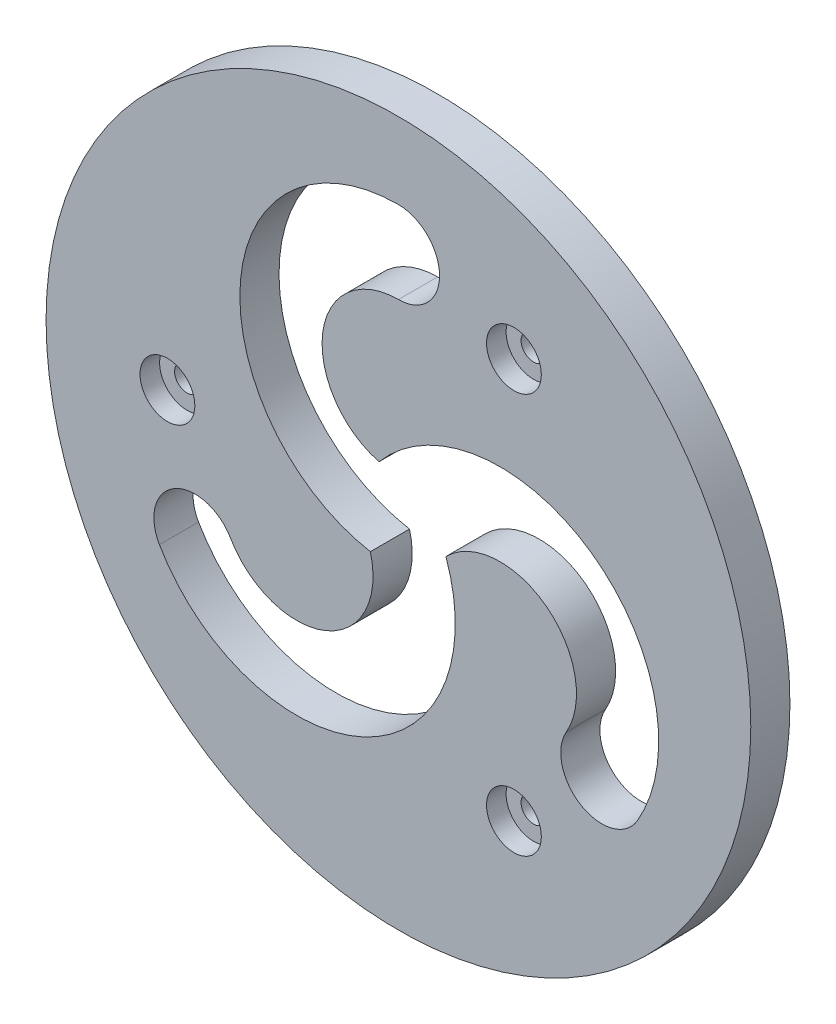
ISO-10303-21;
HEADER;
FILE_DESCRIPTION(('STEP AP214'),'2;1');
FILE_NAME('part.step','',(''),(''),'','','');
FILE_SCHEMA(('AUTOMOTIVE_DESIGN { 1 0 10303 214 1 1 1 1 }'));
ENDSEC;
DATA;
#1=APPLICATION_CONTEXT('core data for automotive mechanical design processes');
#2=APPLICATION_PROTOCOL_DEFINITION('international standard','automotive_design',2000,#1);
#3=PRODUCT_CONTEXT('',#1,'mechanical');
#4=PRODUCT('Part','Part','',(#3));
#5=PRODUCT_RELATED_PRODUCT_CATEGORY('part','',(#4));
#6=PRODUCT_DEFINITION_FORMATION('','',#4);
#7=PRODUCT_DEFINITION_CONTEXT('part definition',#1,'design');
#8=PRODUCT_DEFINITION('design','',#6,#7);
#9=PRODUCT_DEFINITION_SHAPE('','',#8);
#10=(LENGTH_UNIT() NAMED_UNIT(*) SI_UNIT(.MILLI.,.METRE.));
#11=(NAMED_UNIT(*) PLANE_ANGLE_UNIT() SI_UNIT($,.RADIAN.));
#12=(NAMED_UNIT(*) SI_UNIT($,.STERADIAN.) SOLID_ANGLE_UNIT());
#13=UNCERTAINTY_MEASURE_WITH_UNIT(LENGTH_MEASURE(1.E-05),#10,'distance_accuracy_value','');
#14=(GEOMETRIC_REPRESENTATION_CONTEXT(3) GLOBAL_UNCERTAINTY_ASSIGNED_CONTEXT((#13)) GLOBAL_UNIT_ASSIGNED_CONTEXT((#10,
#11,#12)) REPRESENTATION_CONTEXT('',''));
#15=CARTESIAN_POINT('',(0.,0.,0.));
#16=DIRECTION('',(0.,0.,1.));
#17=DIRECTION('',(1.,0.,0.));
#18=AXIS2_PLACEMENT_3D('',#15,#16,#17);
#19=CARTESIAN_POINT('',(14.75,-25.5477494116409,-5.));
#20=DIRECTION('',(0.,0.,1.));
#21=DIRECTION('',(1.,0.,0.));
#22=AXIS2_PLACEMENT_3D('',#19,#20,#21);
#23=CYLINDRICAL_SURFACE('',#22,1.5875);
#24=CARTESIAN_POINT('',(14.75,-25.5477494116409,0.));
#25=DIRECTION('',(0.,0.,1.));
#26=DIRECTION('',(1.,0.,0.));
#27=AXIS2_PLACEMENT_3D('',#24,#25,#26);
#28=CIRCLE('',#27,1.5875);
#29=CARTESIAN_POINT('',(16.3375,-25.5477494116409,0.));
#30=VERTEX_POINT('',#29);
#31=EDGE_CURVE('E221',#30,#30,#28,.T.);
#32=ORIENTED_EDGE('',*,*,#31,.F.);
#33=EDGE_LOOP('',(#32));
#34=FACE_BOUND('',#33,.T.);
#35=CARTESIAN_POINT('',(14.75,-25.5477494116409,2.5));
#36=DIRECTION('',(0.,0.,1.));
#37=DIRECTION('',(1.,0.,0.));
#38=AXIS2_PLACEMENT_3D('',#35,#36,#37);
#39=CIRCLE('',#38,1.5875);
#40=CARTESIAN_POINT('',(16.3375,-25.5477494116409,2.5));
#41=VERTEX_POINT('',#40);
#42=EDGE_CURVE('E71',#41,#41,#39,.F.);
#43=ORIENTED_EDGE('',*,*,#42,.F.);
#44=EDGE_LOOP('',(#43));
#45=FACE_BOUND('',#44,.T.);
#46=ADVANCED_FACE('F67',(#34,#45),#23,.F.);
#47=CARTESIAN_POINT('',(14.75,25.547749411641,-5.));
#48=DIRECTION('',(0.,0.,1.));
#49=DIRECTION('',(1.,0.,0.));
#50=AXIS2_PLACEMENT_3D('',#47,#48,#49);
#51=CYLINDRICAL_SURFACE('',#50,1.58750000000001);
#52=CARTESIAN_POINT('',(14.75,25.547749411641,0.));
#53=DIRECTION('',(0.,0.,1.));
#54=DIRECTION('',(1.,0.,0.));
#55=AXIS2_PLACEMENT_3D('',#52,#53,#54);
#56=CIRCLE('',#55,1.58750000000001);
#57=CARTESIAN_POINT('',(16.3375,25.547749411641,0.));
#58=VERTEX_POINT('',#57);
#59=EDGE_CURVE('E224',#58,#58,#56,.T.);
#60=ORIENTED_EDGE('',*,*,#59,.F.);
#61=EDGE_LOOP('',(#60));
#62=FACE_BOUND('',#61,.T.);
#63=CARTESIAN_POINT('',(14.75,25.547749411641,2.5));
#64=DIRECTION('',(0.,0.,1.));
#65=DIRECTION('',(1.,0.,0.));
#66=AXIS2_PLACEMENT_3D('',#63,#64,#65);
#67=CIRCLE('',#66,1.58750000000001);
#68=CARTESIAN_POINT('',(16.3375,25.547749411641,2.5));
#69=VERTEX_POINT('',#68);
#70=EDGE_CURVE('E231',#69,#69,#67,.F.);
#71=ORIENTED_EDGE('',*,*,#70,.F.);
#72=EDGE_LOOP('',(#71));
#73=FACE_BOUND('',#72,.T.);
#74=ADVANCED_FACE('F242',(#62,#73),#51,.F.);
#75=CARTESIAN_POINT('',(-29.5,0.,-5.));
#76=DIRECTION('',(0.,0.,1.));
#77=DIRECTION('',(1.,0.,0.));
#78=AXIS2_PLACEMENT_3D('',#75,#76,#77);
#79=CYLINDRICAL_SURFACE('',#78,1.5875);
#80=CARTESIAN_POINT('',(-29.5,0.,0.));
#81=DIRECTION('',(0.,0.,1.));
#82=DIRECTION('',(1.,0.,0.));
#83=AXIS2_PLACEMENT_3D('',#80,#81,#82);
#84=CIRCLE('',#83,1.5875);
#85=CARTESIAN_POINT('',(-27.9125,0.,0.));
#86=VERTEX_POINT('',#85);
#87=EDGE_CURVE('E185',#86,#86,#84,.T.);
#88=ORIENTED_EDGE('',*,*,#87,.F.);
#89=EDGE_LOOP('',(#88));
#90=FACE_BOUND('',#89,.T.);
#91=CARTESIAN_POINT('',(-29.5,0.,2.5));
#92=DIRECTION('',(0.,0.,1.));
#93=DIRECTION('',(1.,0.,0.));
#94=AXIS2_PLACEMENT_3D('',#91,#92,#93);
#95=CIRCLE('',#94,1.5875);
#96=CARTESIAN_POINT('',(-27.9125,0.,2.5));
#97=VERTEX_POINT('',#96);
#98=EDGE_CURVE('E229',#97,#97,#95,.F.);
#99=ORIENTED_EDGE('',*,*,#98,.F.);
#100=EDGE_LOOP('',(#99));
#101=FACE_BOUND('',#100,.T.);
#102=ADVANCED_FACE('F248',(#90,#101),#79,.F.);
#103=CARTESIAN_POINT('',(0.,0.,5.));
#104=DIRECTION('',(0.,0.,-1.));
#105=DIRECTION('',(-1.,0.,0.));
#106=AXIS2_PLACEMENT_3D('',#103,#104,#105);
#107=CYLINDRICAL_SURFACE('',#106,45.);
#108=CARTESIAN_POINT('',(0.,0.,5.));
#109=DIRECTION('',(0.,0.,1.));
#110=DIRECTION('',(1.,0.,0.));
#111=AXIS2_PLACEMENT_3D('',#108,#109,#110);
#112=CIRCLE('',#111,45.);
#113=CARTESIAN_POINT('',(45.,0.,5.));
#114=VERTEX_POINT('',#113);
#115=EDGE_CURVE('E12',#114,#114,#112,.T.);
#116=ORIENTED_EDGE('',*,*,#115,.F.);
#117=EDGE_LOOP('',(#116));
#118=FACE_BOUND('',#117,.T.);
#119=CARTESIAN_POINT('',(0.,0.,0.));
#120=DIRECTION('',(0.,0.,1.));
#121=DIRECTION('',(1.,0.,0.));
#122=AXIS2_PLACEMENT_3D('',#119,#120,#121);
#123=CIRCLE('',#122,45.);
#124=CARTESIAN_POINT('',(45.,0.,0.));
#125=VERTEX_POINT('',#124);
#126=EDGE_CURVE('E76',#125,#125,#123,.T.);
#127=ORIENTED_EDGE('',*,*,#126,.T.);
#128=EDGE_LOOP('',(#127));
#129=FACE_BOUND('',#128,.T.);
#130=ADVANCED_FACE('F69',(#118,#129),#107,.T.);
#131=CARTESIAN_POINT('',(0.,0.,5.));
#132=DIRECTION('',(0.,0.,1.));
#133=DIRECTION('',(1.,0.,0.));
#134=AXIS2_PLACEMENT_3D('',#131,#132,#133);
#135=PLANE('',#134);
#136=CARTESIAN_POINT('',(-29.5,0.,5.));
#137=DIRECTION('',(0.,0.,1.));
#138=DIRECTION('',(1.,0.,0.));
#139=AXIS2_PLACEMENT_3D('',#136,#137,#138);
#140=CIRCLE('',#139,3.5);
#141=CARTESIAN_POINT('',(-26.,0.,5.));
#142=VERTEX_POINT('',#141);
#143=EDGE_CURVE('E344',#142,#142,#140,.T.);
#144=ORIENTED_EDGE('',*,*,#143,.F.);
#145=EDGE_LOOP('',(#144));
#146=FACE_BOUND('',#145,.T.);
#147=CARTESIAN_POINT('',(14.75,-25.5477494116409,5.));
#148=DIRECTION('',(0.,0.,1.));
#149=DIRECTION('',(1.,0.,0.));
#150=AXIS2_PLACEMENT_3D('',#147,#148,#149);
#151=CIRCLE('',#150,3.5);
#152=CARTESIAN_POINT('',(18.25,-25.5477494116409,5.));
#153=VERTEX_POINT('',#152);
#154=EDGE_CURVE('E337',#153,#153,#151,.T.);
#155=ORIENTED_EDGE('',*,*,#154,.F.);
#156=EDGE_LOOP('',(#155));
#157=FACE_BOUND('',#156,.T.);
#158=CARTESIAN_POINT('',(14.75,25.547749411641,5.));
#159=DIRECTION('',(0.,0.,1.));
#160=DIRECTION('',(1.,0.,0.));
#161=AXIS2_PLACEMENT_3D('',#158,#159,#160);
#162=CIRCLE('',#161,3.5);
#163=CARTESIAN_POINT('',(18.25,25.547749411641,5.));
#164=VERTEX_POINT('',#163);
#165=EDGE_CURVE('E165',#164,#164,#162,.T.);
#166=ORIENTED_EDGE('',*,*,#165,.F.);
#167=EDGE_LOOP('',(#166));
#168=FACE_BOUND('',#167,.T.);
#169=CARTESIAN_POINT('',(0.,15.,5.));
#170=DIRECTION('',(0.,0.,1.));
#171=DIRECTION('',(1.,0.,0.));
#172=AXIS2_PLACEMENT_3D('',#169,#170,#171);
#173=CIRCLE('',#172,20.25);
#174=CARTESIAN_POINT('',(0.,35.25,5.));
#175=VERTEX_POINT('',#174);
#176=CARTESIAN_POINT('',(-3.58516212247075,-4.93010568350306,5.));
#177=VERTEX_POINT('',#176);
#178=EDGE_CURVE('E84',#175,#177,#173,.T.);
#179=ORIENTED_EDGE('',*,*,#178,.F.);
#180=CARTESIAN_POINT('',(0.,30.,5.));
#181=DIRECTION('',(0.,0.,1.));
#182=DIRECTION('',(1.,0.,0.));
#183=AXIS2_PLACEMENT_3D('',#180,#181,#182);
#184=CIRCLE('',#183,5.25);
#185=CARTESIAN_POINT('',(0.,24.75,5.));
#186=VERTEX_POINT('',#185);
#187=EDGE_CURVE('E159',#186,#175,#184,.T.);
#188=ORIENTED_EDGE('',*,*,#187,.F.);
#189=CARTESIAN_POINT('',(0.,15.,5.));
#190=DIRECTION('',(0.,0.,1.));
#191=DIRECTION('',(1.,0.,0.));
#192=AXIS2_PLACEMENT_3D('',#189,#190,#191);
#193=CIRCLE('',#192,9.75);
#194=CARTESIAN_POINT('',(-2.47701570402032,5.56989431649694,5.));
#195=VERTEX_POINT('',#194);
#196=EDGE_CURVE('E162',#186,#195,#193,.T.);
#197=ORIENTED_EDGE('',*,*,#196,.T.);
#198=CARTESIAN_POINT('',(12.9903810567666,-7.49999999999999,5.));
#199=DIRECTION('',(0.,0.,1.));
#200=DIRECTION('',(1.,0.,0.));
#201=AXIS2_PLACEMENT_3D('',#198,#199,#200);
#202=CIRCLE('',#201,20.25);
#203=CARTESIAN_POINT('',(30.5273954834037,-17.6249999999983,5.));
#204=VERTEX_POINT('',#203);
#205=EDGE_CURVE('E199',#204,#195,#202,.T.);
#206=ORIENTED_EDGE('',*,*,#205,.F.);
#207=CARTESIAN_POINT('',(25.9807621135351,-14.9999999999989,5.));
#208=DIRECTION('',(0.,0.,1.));
#209=DIRECTION('',(1.,0.,0.));
#210=AXIS2_PLACEMENT_3D('',#207,#208,#209);
#211=CIRCLE('',#210,5.25);
#212=CARTESIAN_POINT('',(21.4341287436663,-12.3749999999994,5.));
#213=VERTEX_POINT('',#212);
#214=EDGE_CURVE('E196',#213,#204,#211,.T.);
#215=ORIENTED_EDGE('',*,*,#214,.F.);
#216=CARTESIAN_POINT('',(12.9903810567666,-7.49999999999999,5.));
#217=DIRECTION('',(0.,0.,1.));
#218=DIRECTION('',(1.,0.,0.));
#219=AXIS2_PLACEMENT_3D('',#216,#217,#218);
#220=CIRCLE('',#219,9.75);
#221=CARTESIAN_POINT('',(6.06217782649108,-0.639788632993871,5.));
#222=VERTEX_POINT('',#221);
#223=EDGE_CURVE('E193',#213,#222,#220,.T.);
#224=ORIENTED_EDGE('',*,*,#223,.T.);
#225=CARTESIAN_POINT('',(-12.9903810567666,-7.50000000000001,5.));
#226=DIRECTION('',(0.,0.,1.));
#227=DIRECTION('',(1.,0.,0.));
#228=AXIS2_PLACEMENT_3D('',#225,#226,#227);
#229=CIRCLE('',#228,20.25);
#230=CARTESIAN_POINT('',(-30.5273954833992,-17.6250000000017,5.));
#231=VERTEX_POINT('',#230);
#232=EDGE_CURVE('E190',#231,#222,#229,.T.);
#233=ORIENTED_EDGE('',*,*,#232,.F.);
#234=CARTESIAN_POINT('',(-25.9807621135312,-15.0000000000011,5.));
#235=DIRECTION('',(0.,0.,1.));
#236=DIRECTION('',(1.,0.,0.));
#237=AXIS2_PLACEMENT_3D('',#234,#235,#236);
#238=CIRCLE('',#237,5.25);
#239=CARTESIAN_POINT('',(-21.4341287436634,-12.3750000000006,5.));
#240=VERTEX_POINT('',#239);
#241=EDGE_CURVE('E187',#240,#231,#238,.T.);
#242=ORIENTED_EDGE('',*,*,#241,.F.);
#243=CARTESIAN_POINT('',(-12.9903810567666,-7.50000000000001,5.));
#244=DIRECTION('',(0.,0.,1.));
#245=DIRECTION('',(1.,0.,0.));
#246=AXIS2_PLACEMENT_3D('',#243,#244,#245);
#247=CIRCLE('',#246,9.75);
#248=EDGE_CURVE('E184',#240,#177,#247,.T.);
#249=ORIENTED_EDGE('',*,*,#248,.T.);
#250=EDGE_LOOP('',(#179,#188,#197,#206,#215,#224,#233,#242,#249));
#251=FACE_BOUND('',#250,.T.);
#252=ORIENTED_EDGE('',*,*,#115,.T.);
#253=EDGE_LOOP('',(#252));
#254=FACE_BOUND('',#253,.T.);
#255=ADVANCED_FACE('F286',(#146,#157,#168,#251,#254),#135,.T.);
#256=CARTESIAN_POINT('',(0.,0.,0.));
#257=DIRECTION('',(0.,0.,1.));
#258=DIRECTION('',(1.,0.,0.));
#259=AXIS2_PLACEMENT_3D('',#256,#257,#258);
#260=PLANE('',#259);
#261=ORIENTED_EDGE('',*,*,#87,.T.);
#262=EDGE_LOOP('',(#261));
#263=FACE_BOUND('',#262,.T.);
#264=ORIENTED_EDGE('',*,*,#59,.T.);
#265=EDGE_LOOP('',(#264));
#266=FACE_BOUND('',#265,.T.);
#267=ORIENTED_EDGE('',*,*,#31,.T.);
#268=EDGE_LOOP('',(#267));
#269=FACE_BOUND('',#268,.T.);
#270=CARTESIAN_POINT('',(0.,30.,0.));
#271=DIRECTION('',(0.,0.,1.));
#272=DIRECTION('',(1.,0.,0.));
#273=AXIS2_PLACEMENT_3D('',#270,#271,#272);
#274=CIRCLE('',#273,5.25);
#275=CARTESIAN_POINT('',(0.,24.75,0.));
#276=VERTEX_POINT('',#275);
#277=CARTESIAN_POINT('',(0.,35.25,0.));
#278=VERTEX_POINT('',#277);
#279=EDGE_CURVE('E153',#276,#278,#274,.T.);
#280=ORIENTED_EDGE('',*,*,#279,.T.);
#281=CARTESIAN_POINT('',(0.,15.,0.));
#282=DIRECTION('',(0.,0.,1.));
#283=DIRECTION('',(1.,0.,0.));
#284=AXIS2_PLACEMENT_3D('',#281,#282,#283);
#285=CIRCLE('',#284,20.25);
#286=CARTESIAN_POINT('',(-3.58516212247075,-4.93010568350306,0.));
#287=VERTEX_POINT('',#286);
#288=EDGE_CURVE('E148',#278,#287,#285,.T.);
#289=ORIENTED_EDGE('',*,*,#288,.T.);
#290=CARTESIAN_POINT('',(-12.9903810567666,-7.50000000000001,0.));
#291=DIRECTION('',(0.,0.,1.));
#292=DIRECTION('',(1.,0.,0.));
#293=AXIS2_PLACEMENT_3D('',#290,#291,#292);
#294=CIRCLE('',#293,9.75);
#295=CARTESIAN_POINT('',(-21.4341287436642,-12.3750000000011,0.));
#296=VERTEX_POINT('',#295);
#297=EDGE_CURVE('E140',#296,#287,#294,.T.);
#298=ORIENTED_EDGE('',*,*,#297,.F.);
#299=CARTESIAN_POINT('',(-25.9807621135312,-15.0000000000011,0.));
#300=DIRECTION('',(0.,0.,1.));
#301=DIRECTION('',(1.,0.,0.));
#302=AXIS2_PLACEMENT_3D('',#299,#300,#301);
#303=CIRCLE('',#302,5.25);
#304=CARTESIAN_POINT('',(-30.5273954833992,-17.6250000000017,0.));
#305=VERTEX_POINT('',#304);
#306=EDGE_CURVE('E92',#296,#305,#303,.T.);
#307=ORIENTED_EDGE('',*,*,#306,.T.);
#308=CARTESIAN_POINT('',(-12.9903810567666,-7.50000000000001,0.));
#309=DIRECTION('',(0.,0.,1.));
#310=DIRECTION('',(1.,0.,0.));
#311=AXIS2_PLACEMENT_3D('',#308,#309,#310);
#312=CIRCLE('',#311,20.25);
#313=CARTESIAN_POINT('',(6.06217782649108,-0.639788632993871,0.));
#314=VERTEX_POINT('',#313);
#315=EDGE_CURVE('E169',#305,#314,#312,.T.);
#316=ORIENTED_EDGE('',*,*,#315,.T.);
#317=CARTESIAN_POINT('',(12.9903810567666,-7.49999999999999,0.));
#318=DIRECTION('',(0.,0.,1.));
#319=DIRECTION('',(1.,0.,0.));
#320=AXIS2_PLACEMENT_3D('',#317,#318,#319);
#321=CIRCLE('',#320,9.75);
#322=CARTESIAN_POINT('',(21.4341287436663,-12.3749999999994,0.));
#323=VERTEX_POINT('',#322);
#324=EDGE_CURVE('E172',#323,#314,#321,.T.);
#325=ORIENTED_EDGE('',*,*,#324,.F.);
#326=CARTESIAN_POINT('',(25.9807621135351,-14.9999999999989,0.));
#327=DIRECTION('',(0.,0.,1.));
#328=DIRECTION('',(1.,0.,0.));
#329=AXIS2_PLACEMENT_3D('',#326,#327,#328);
#330=CIRCLE('',#329,5.25);
#331=CARTESIAN_POINT('',(30.5273954834037,-17.6249999999983,0.));
#332=VERTEX_POINT('',#331);
#333=EDGE_CURVE('E174',#323,#332,#330,.T.);
#334=ORIENTED_EDGE('',*,*,#333,.T.);
#335=CARTESIAN_POINT('',(12.9903810567666,-7.49999999999999,0.));
#336=DIRECTION('',(0.,0.,1.));
#337=DIRECTION('',(1.,0.,0.));
#338=AXIS2_PLACEMENT_3D('',#335,#336,#337);
#339=CIRCLE('',#338,20.25);
#340=CARTESIAN_POINT('',(-2.47701570402032,5.56989431649694,0.));
#341=VERTEX_POINT('',#340);
#342=EDGE_CURVE('E177',#332,#341,#339,.T.);
#343=ORIENTED_EDGE('',*,*,#342,.T.);
#344=CARTESIAN_POINT('',(0.,15.,0.));
#345=DIRECTION('',(0.,0.,1.));
#346=DIRECTION('',(1.,0.,0.));
#347=AXIS2_PLACEMENT_3D('',#344,#345,#346);
#348=CIRCLE('',#347,9.75);
#349=EDGE_CURVE('E180',#276,#341,#348,.T.);
#350=ORIENTED_EDGE('',*,*,#349,.F.);
#351=EDGE_LOOP('',(#280,#289,#298,#307,#316,#325,#334,#343,#350));
#352=FACE_BOUND('',#351,.T.);
#353=ORIENTED_EDGE('',*,*,#126,.F.);
#354=EDGE_LOOP('',(#353));
#355=FACE_BOUND('',#354,.T.);
#356=ADVANCED_FACE('F155',(#263,#266,#269,#352,#355),#260,.F.);
#357=CARTESIAN_POINT('',(0.,15.,0.));
#358=DIRECTION('',(0.,0.,1.));
#359=DIRECTION('',(1.,0.,0.));
#360=AXIS2_PLACEMENT_3D('',#357,#358,#359);
#361=CYLINDRICAL_SURFACE('',#360,20.25);
#362=ORIENTED_EDGE('',*,*,#178,.T.);
#363=DIRECTION('',(0.,0.,1.));
#364=VECTOR('',#363,1.);
#365=CARTESIAN_POINT('',(-3.58516212247075,-4.93010568350306,0.));
#366=LINE('',#365,#364);
#367=EDGE_CURVE('E143',#287,#177,#366,.T.);
#368=ORIENTED_EDGE('',*,*,#367,.F.);
#369=ORIENTED_EDGE('',*,*,#288,.F.);
#370=DIRECTION('',(0.,0.,1.));
#371=VECTOR('',#370,1.);
#372=CARTESIAN_POINT('',(0.,35.25,0.));
#373=LINE('',#372,#371);
#374=EDGE_CURVE('E204',#278,#175,#373,.T.);
#375=ORIENTED_EDGE('',*,*,#374,.T.);
#376=EDGE_LOOP('',(#362,#368,#369,#375));
#377=FACE_BOUND('',#376,.T.);
#378=ADVANCED_FACE('F151',(#377),#361,.F.);
#379=CARTESIAN_POINT('',(0.,30.,0.));
#380=DIRECTION('',(0.,0.,1.));
#381=DIRECTION('',(1.,0.,0.));
#382=AXIS2_PLACEMENT_3D('',#379,#380,#381);
#383=CYLINDRICAL_SURFACE('',#382,5.25);
#384=ORIENTED_EDGE('',*,*,#187,.T.);
#385=ORIENTED_EDGE('',*,*,#374,.F.);
#386=ORIENTED_EDGE('',*,*,#279,.F.);
#387=DIRECTION('',(0.,0.,1.));
#388=VECTOR('',#387,1.);
#389=CARTESIAN_POINT('',(0.,24.75,0.));
#390=LINE('',#389,#388);
#391=EDGE_CURVE('E206',#276,#186,#390,.T.);
#392=ORIENTED_EDGE('',*,*,#391,.T.);
#393=EDGE_LOOP('',(#384,#385,#386,#392));
#394=FACE_BOUND('',#393,.T.);
#395=ADVANCED_FACE('F254',(#394),#383,.F.);
#396=CARTESIAN_POINT('',(0.,15.,0.));
#397=DIRECTION('',(0.,0.,1.));
#398=DIRECTION('',(1.,0.,0.));
#399=AXIS2_PLACEMENT_3D('',#396,#397,#398);
#400=CYLINDRICAL_SURFACE('',#399,9.75);
#401=ORIENTED_EDGE('',*,*,#196,.F.);
#402=ORIENTED_EDGE('',*,*,#391,.F.);
#403=ORIENTED_EDGE('',*,*,#349,.T.);
#404=DIRECTION('',(0.,0.,1.));
#405=VECTOR('',#404,1.);
#406=CARTESIAN_POINT('',(-2.47701570402032,5.56989431649694,0.));
#407=LINE('',#406,#405);
#408=EDGE_CURVE('E208',#341,#195,#407,.T.);
#409=ORIENTED_EDGE('',*,*,#408,.T.);
#410=EDGE_LOOP('',(#401,#402,#403,#409));
#411=FACE_BOUND('',#410,.T.);
#412=ADVANCED_FACE('F257',(#411),#400,.T.);
#413=CARTESIAN_POINT('',(12.9903810567666,-7.49999999999999,0.));
#414=DIRECTION('',(0.,0.,1.));
#415=DIRECTION('',(1.,0.,0.));
#416=AXIS2_PLACEMENT_3D('',#413,#414,#415);
#417=CYLINDRICAL_SURFACE('',#416,20.25);
#418=ORIENTED_EDGE('',*,*,#205,.T.);
#419=ORIENTED_EDGE('',*,*,#408,.F.);
#420=ORIENTED_EDGE('',*,*,#342,.F.);
#421=DIRECTION('',(0.,0.,1.));
#422=VECTOR('',#421,1.);
#423=CARTESIAN_POINT('',(30.5273954834037,-17.6249999999983,0.));
#424=LINE('',#423,#422);
#425=EDGE_CURVE('E210',#332,#204,#424,.T.);
#426=ORIENTED_EDGE('',*,*,#425,.T.);
#427=EDGE_LOOP('',(#418,#419,#420,#426));
#428=FACE_BOUND('',#427,.T.);
#429=ADVANCED_FACE('F261',(#428),#417,.F.);
#430=CARTESIAN_POINT('',(25.9807621135351,-14.9999999999989,0.));
#431=DIRECTION('',(0.,0.,1.));
#432=DIRECTION('',(1.,0.,0.));
#433=AXIS2_PLACEMENT_3D('',#430,#431,#432);
#434=CYLINDRICAL_SURFACE('',#433,5.25);
#435=ORIENTED_EDGE('',*,*,#214,.T.);
#436=ORIENTED_EDGE('',*,*,#425,.F.);
#437=ORIENTED_EDGE('',*,*,#333,.F.);
#438=DIRECTION('',(0.,0.,1.));
#439=VECTOR('',#438,1.);
#440=CARTESIAN_POINT('',(21.4341287436663,-12.3749999999994,0.));
#441=LINE('',#440,#439);
#442=EDGE_CURVE('E212',#323,#213,#441,.T.);
#443=ORIENTED_EDGE('',*,*,#442,.T.);
#444=EDGE_LOOP('',(#435,#436,#437,#443));
#445=FACE_BOUND('',#444,.T.);
#446=ADVANCED_FACE('F265',(#445),#434,.F.);
#447=CARTESIAN_POINT('',(12.9903810567666,-7.49999999999999,0.));
#448=DIRECTION('',(0.,0.,1.));
#449=DIRECTION('',(1.,0.,0.));
#450=AXIS2_PLACEMENT_3D('',#447,#448,#449);
#451=CYLINDRICAL_SURFACE('',#450,9.75);
#452=ORIENTED_EDGE('',*,*,#223,.F.);
#453=ORIENTED_EDGE('',*,*,#442,.F.);
#454=ORIENTED_EDGE('',*,*,#324,.T.);
#455=DIRECTION('',(0.,0.,1.));
#456=VECTOR('',#455,1.);
#457=CARTESIAN_POINT('',(6.06217782649108,-0.639788632993871,0.));
#458=LINE('',#457,#456);
#459=EDGE_CURVE('E214',#314,#222,#458,.T.);
#460=ORIENTED_EDGE('',*,*,#459,.T.);
#461=EDGE_LOOP('',(#452,#453,#454,#460));
#462=FACE_BOUND('',#461,.T.);
#463=ADVANCED_FACE('F269',(#462),#451,.T.);
#464=CARTESIAN_POINT('',(-12.9903810567666,-7.50000000000001,0.));
#465=DIRECTION('',(0.,0.,1.));
#466=DIRECTION('',(1.,0.,0.));
#467=AXIS2_PLACEMENT_3D('',#464,#465,#466);
#468=CYLINDRICAL_SURFACE('',#467,20.25);
#469=ORIENTED_EDGE('',*,*,#232,.T.);
#470=ORIENTED_EDGE('',*,*,#459,.F.);
#471=ORIENTED_EDGE('',*,*,#315,.F.);
#472=DIRECTION('',(0.,0.,1.));
#473=VECTOR('',#472,1.);
#474=CARTESIAN_POINT('',(-30.5273954833992,-17.6250000000017,0.));
#475=LINE('',#474,#473);
#476=EDGE_CURVE('E216',#305,#231,#475,.T.);
#477=ORIENTED_EDGE('',*,*,#476,.T.);
#478=EDGE_LOOP('',(#469,#470,#471,#477));
#479=FACE_BOUND('',#478,.T.);
#480=ADVANCED_FACE('F273',(#479),#468,.F.);
#481=CARTESIAN_POINT('',(-25.9807621135312,-15.0000000000011,0.));
#482=DIRECTION('',(0.,0.,1.));
#483=DIRECTION('',(1.,0.,0.));
#484=AXIS2_PLACEMENT_3D('',#481,#482,#483);
#485=CYLINDRICAL_SURFACE('',#484,5.25);
#486=ORIENTED_EDGE('',*,*,#241,.T.);
#487=ORIENTED_EDGE('',*,*,#476,.F.);
#488=ORIENTED_EDGE('',*,*,#306,.F.);
#489=DIRECTION('',(0.,0.,1.));
#490=VECTOR('',#489,1.);
#491=CARTESIAN_POINT('',(-21.4341287436634,-12.3750000000006,0.));
#492=LINE('',#491,#490);
#493=EDGE_CURVE('E145',#296,#240,#492,.T.);
#494=ORIENTED_EDGE('',*,*,#493,.T.);
#495=EDGE_LOOP('',(#486,#487,#488,#494));
#496=FACE_BOUND('',#495,.T.);
#497=ADVANCED_FACE('F277',(#496),#485,.F.);
#498=CARTESIAN_POINT('',(-12.9903810567666,-7.50000000000001,0.));
#499=DIRECTION('',(0.,0.,1.));
#500=DIRECTION('',(1.,0.,0.));
#501=AXIS2_PLACEMENT_3D('',#498,#499,#500);
#502=CYLINDRICAL_SURFACE('',#501,9.75);
#503=ORIENTED_EDGE('',*,*,#248,.F.);
#504=ORIENTED_EDGE('',*,*,#493,.F.);
#505=ORIENTED_EDGE('',*,*,#297,.T.);
#506=ORIENTED_EDGE('',*,*,#367,.T.);
#507=EDGE_LOOP('',(#503,#504,#505,#506));
#508=FACE_BOUND('',#507,.T.);
#509=ADVANCED_FACE('F142',(#508),#502,.T.);
#510=CARTESIAN_POINT('',(-29.5,0.,2.5));
#511=DIRECTION('',(0.,0.,1.));
#512=DIRECTION('',(1.,0.,0.));
#513=AXIS2_PLACEMENT_3D('',#510,#511,#512);
#514=PLANE('',#513);
#515=CARTESIAN_POINT('',(-29.5,0.,2.5));
#516=DIRECTION('',(0.,0.,1.));
#517=DIRECTION('',(1.,0.,0.));
#518=AXIS2_PLACEMENT_3D('',#515,#516,#517);
#519=CIRCLE('',#518,3.5);
#520=CARTESIAN_POINT('',(-26.,0.,2.5));
#521=VERTEX_POINT('',#520);
#522=EDGE_CURVE('E232',#521,#521,#519,.T.);
#523=ORIENTED_EDGE('',*,*,#522,.T.);
#524=EDGE_LOOP('',(#523));
#525=FACE_BOUND('',#524,.T.);
#526=ORIENTED_EDGE('',*,*,#98,.T.);
#527=EDGE_LOOP('',(#526));
#528=FACE_BOUND('',#527,.T.);
#529=ADVANCED_FACE('F283',(#525,#528),#514,.T.);
#530=CARTESIAN_POINT('',(-29.5,0.,2.5));
#531=DIRECTION('',(0.,0.,1.));
#532=DIRECTION('',(1.,0.,0.));
#533=AXIS2_PLACEMENT_3D('',#530,#531,#532);
#534=CYLINDRICAL_SURFACE('',#533,3.5);
#535=ORIENTED_EDGE('',*,*,#522,.F.);
#536=EDGE_LOOP('',(#535));
#537=FACE_BOUND('',#536,.T.);
#538=ORIENTED_EDGE('',*,*,#143,.T.);
#539=EDGE_LOOP('',(#538));
#540=FACE_BOUND('',#539,.T.);
#541=ADVANCED_FACE('F304',(#537,#540),#534,.F.);
#542=CARTESIAN_POINT('',(14.75,25.547749411641,2.5));
#543=DIRECTION('',(0.,0.,1.));
#544=DIRECTION('',(1.,0.,0.));
#545=AXIS2_PLACEMENT_3D('',#542,#543,#544);
#546=PLANE('',#545);
#547=CARTESIAN_POINT('',(14.75,25.547749411641,2.5));
#548=DIRECTION('',(0.,0.,1.));
#549=DIRECTION('',(1.,0.,0.));
#550=AXIS2_PLACEMENT_3D('',#547,#548,#549);
#551=CIRCLE('',#550,3.5);
#552=CARTESIAN_POINT('',(18.25,25.547749411641,2.5));
#553=VERTEX_POINT('',#552);
#554=EDGE_CURVE('E333',#553,#553,#551,.T.);
#555=ORIENTED_EDGE('',*,*,#554,.T.);
#556=EDGE_LOOP('',(#555));
#557=FACE_BOUND('',#556,.T.);
#558=ORIENTED_EDGE('',*,*,#70,.T.);
#559=EDGE_LOOP('',(#558));
#560=FACE_BOUND('',#559,.T.);
#561=ADVANCED_FACE('F310',(#557,#560),#546,.T.);
#562=CARTESIAN_POINT('',(14.75,25.547749411641,2.5));
#563=DIRECTION('',(0.,0.,1.));
#564=DIRECTION('',(1.,0.,0.));
#565=AXIS2_PLACEMENT_3D('',#562,#563,#564);
#566=CYLINDRICAL_SURFACE('',#565,3.5);
#567=ORIENTED_EDGE('',*,*,#554,.F.);
#568=EDGE_LOOP('',(#567));
#569=FACE_BOUND('',#568,.T.);
#570=ORIENTED_EDGE('',*,*,#165,.T.);
#571=EDGE_LOOP('',(#570));
#572=FACE_BOUND('',#571,.T.);
#573=ADVANCED_FACE('F318',(#569,#572),#566,.F.);
#574=CARTESIAN_POINT('',(14.75,-25.5477494116409,2.5));
#575=DIRECTION('',(0.,0.,1.));
#576=DIRECTION('',(1.,0.,0.));
#577=AXIS2_PLACEMENT_3D('',#574,#575,#576);
#578=PLANE('',#577);
#579=CARTESIAN_POINT('',(14.75,-25.5477494116409,2.5));
#580=DIRECTION('',(0.,0.,1.));
#581=DIRECTION('',(1.,0.,0.));
#582=AXIS2_PLACEMENT_3D('',#579,#580,#581);
#583=CIRCLE('',#582,3.5);
#584=CARTESIAN_POINT('',(18.25,-25.5477494116409,2.5));
#585=VERTEX_POINT('',#584);
#586=EDGE_CURVE('E339',#585,#585,#583,.T.);
#587=ORIENTED_EDGE('',*,*,#586,.T.);
#588=EDGE_LOOP('',(#587));
#589=FACE_BOUND('',#588,.T.);
#590=ORIENTED_EDGE('',*,*,#42,.T.);
#591=EDGE_LOOP('',(#590));
#592=FACE_BOUND('',#591,.T.);
#593=ADVANCED_FACE('F239',(#589,#592),#578,.T.);
#594=CARTESIAN_POINT('',(14.75,-25.5477494116409,2.5));
#595=DIRECTION('',(0.,0.,1.));
#596=DIRECTION('',(1.,0.,0.));
#597=AXIS2_PLACEMENT_3D('',#594,#595,#596);
#598=CYLINDRICAL_SURFACE('',#597,3.5);
#599=ORIENTED_EDGE('',*,*,#586,.F.);
#600=EDGE_LOOP('',(#599));
#601=FACE_BOUND('',#600,.T.);
#602=ORIENTED_EDGE('',*,*,#154,.T.);
#603=EDGE_LOOP('',(#602));
#604=FACE_BOUND('',#603,.T.);
#605=ADVANCED_FACE('F317',(#601,#604),#598,.F.);
#606=CLOSED_SHELL('',(#46,#74,#102,#130,#255,#356,#378,#395,#412,#429,#446,#463,#480,#497,#509,
#529,#541,#561,#573,#593,#605));
#607=MANIFOLD_SOLID_BREP('B2',#606);
#608=ADVANCED_BREP_SHAPE_REPRESENTATION('',(#18,#607),#14);
#609=SHAPE_DEFINITION_REPRESENTATION(#9,#608);
ENDSEC;
END-ISO-10303-21;
